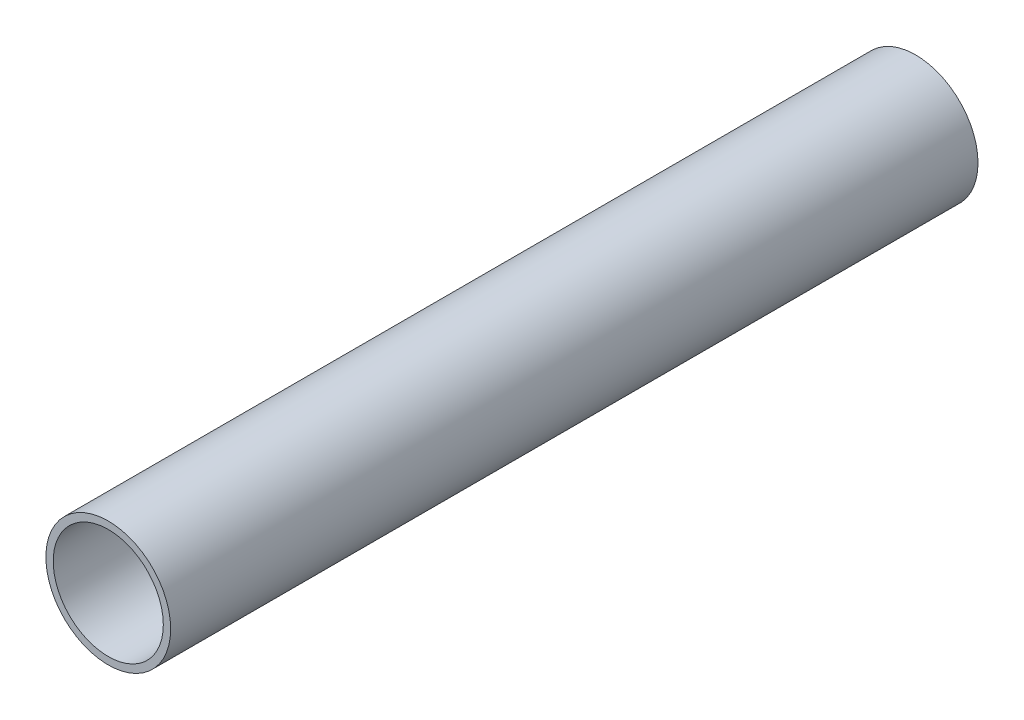
ISO-10303-21;
HEADER;
FILE_DESCRIPTION(('STEP AP214'),'2;1');
FILE_NAME('part.step','',(''),(''),'','','');
FILE_SCHEMA(('AUTOMOTIVE_DESIGN { 1 0 10303 214 1 1 1 1 }'));
ENDSEC;
DATA;
#1=APPLICATION_CONTEXT('core data for automotive mechanical design processes');
#2=APPLICATION_PROTOCOL_DEFINITION('international standard','automotive_design',2000,#1);
#3=PRODUCT_CONTEXT('',#1,'mechanical');
#4=PRODUCT('Part','Part','',(#3));
#5=PRODUCT_RELATED_PRODUCT_CATEGORY('part','',(#4));
#6=PRODUCT_DEFINITION_FORMATION('','',#4);
#7=PRODUCT_DEFINITION_CONTEXT('part definition',#1,'design');
#8=PRODUCT_DEFINITION('design','',#6,#7);
#9=PRODUCT_DEFINITION_SHAPE('','',#8);
#10=(LENGTH_UNIT() NAMED_UNIT(*) SI_UNIT(.MILLI.,.METRE.));
#11=(NAMED_UNIT(*) PLANE_ANGLE_UNIT() SI_UNIT($,.RADIAN.));
#12=(NAMED_UNIT(*) SI_UNIT($,.STERADIAN.) SOLID_ANGLE_UNIT());
#13=UNCERTAINTY_MEASURE_WITH_UNIT(LENGTH_MEASURE(1.E-05),#10,'distance_accuracy_value','');
#14=(GEOMETRIC_REPRESENTATION_CONTEXT(3) GLOBAL_UNCERTAINTY_ASSIGNED_CONTEXT((#13)) GLOBAL_UNIT_ASSIGNED_CONTEXT((#10,
#11,#12)) REPRESENTATION_CONTEXT('',''));
#15=CARTESIAN_POINT('',(0.,0.,0.));
#16=DIRECTION('',(0.,0.,1.));
#17=DIRECTION('',(1.,0.,0.));
#18=AXIS2_PLACEMENT_3D('',#15,#16,#17);
#19=CARTESIAN_POINT('',(0.,0.,110.));
#20=DIRECTION('',(0.,0.,-1.));
#21=DIRECTION('',(-1.,0.,0.));
#22=AXIS2_PLACEMENT_3D('',#19,#20,#21);
#23=CYLINDRICAL_SURFACE('',#22,15.);
#24=CARTESIAN_POINT('',(0.,0.,110.));
#25=DIRECTION('',(0.,0.,1.));
#26=DIRECTION('',(1.,0.,0.));
#27=AXIS2_PLACEMENT_3D('',#24,#25,#26);
#28=CIRCLE('',#27,15.);
#29=CARTESIAN_POINT('',(15.,0.,110.));
#30=VERTEX_POINT('',#29);
#31=EDGE_CURVE('E40',#30,#30,#28,.T.);
#32=ORIENTED_EDGE('',*,*,#31,.T.);
#33=EDGE_LOOP('',(#32));
#34=FACE_BOUND('',#33,.T.);
#35=CARTESIAN_POINT('',(0.,0.,-110.));
#36=DIRECTION('',(0.,0.,1.));
#37=DIRECTION('',(1.,0.,0.));
#38=AXIS2_PLACEMENT_3D('',#35,#36,#37);
#39=CIRCLE('',#38,15.);
#40=CARTESIAN_POINT('',(15.,0.,-110.));
#41=VERTEX_POINT('',#40);
#42=EDGE_CURVE('E46',#41,#41,#39,.T.);
#43=ORIENTED_EDGE('',*,*,#42,.F.);
#44=EDGE_LOOP('',(#43));
#45=FACE_BOUND('',#44,.T.);
#46=ADVANCED_FACE('F33',(#34,#45),#23,.F.);
#47=CARTESIAN_POINT('',(0.,0.,110.));
#48=DIRECTION('',(0.,0.,-1.));
#49=DIRECTION('',(-1.,0.,0.));
#50=AXIS2_PLACEMENT_3D('',#47,#48,#49);
#51=CYLINDRICAL_SURFACE('',#50,17.);
#52=CARTESIAN_POINT('',(0.,0.,110.));
#53=DIRECTION('',(0.,0.,1.));
#54=DIRECTION('',(1.,0.,0.));
#55=AXIS2_PLACEMENT_3D('',#52,#53,#54);
#56=CIRCLE('',#55,17.);
#57=CARTESIAN_POINT('',(17.,0.,110.));
#58=VERTEX_POINT('',#57);
#59=EDGE_CURVE('E10',#58,#58,#56,.T.);
#60=ORIENTED_EDGE('',*,*,#59,.F.);
#61=EDGE_LOOP('',(#60));
#62=FACE_BOUND('',#61,.T.);
#63=CARTESIAN_POINT('',(0.,0.,-110.));
#64=DIRECTION('',(0.,0.,1.));
#65=DIRECTION('',(1.,0.,0.));
#66=AXIS2_PLACEMENT_3D('',#63,#64,#65);
#67=CIRCLE('',#66,17.);
#68=CARTESIAN_POINT('',(17.,0.,-110.));
#69=VERTEX_POINT('',#68);
#70=EDGE_CURVE('E36',#69,#69,#67,.T.);
#71=ORIENTED_EDGE('',*,*,#70,.T.);
#72=EDGE_LOOP('',(#71));
#73=FACE_BOUND('',#72,.T.);
#74=ADVANCED_FACE('F53',(#62,#73),#51,.T.);
#75=CARTESIAN_POINT('',(0.,0.,110.));
#76=DIRECTION('',(0.,0.,1.));
#77=DIRECTION('',(1.,0.,0.));
#78=AXIS2_PLACEMENT_3D('',#75,#76,#77);
#79=PLANE('',#78);
#80=ORIENTED_EDGE('',*,*,#31,.F.);
#81=EDGE_LOOP('',(#80));
#82=FACE_BOUND('',#81,.T.);
#83=ORIENTED_EDGE('',*,*,#59,.T.);
#84=EDGE_LOOP('',(#83));
#85=FACE_BOUND('',#84,.T.);
#86=ADVANCED_FACE('F57',(#82,#85),#79,.T.);
#87=CARTESIAN_POINT('',(0.,0.,-110.));
#88=DIRECTION('',(0.,0.,1.));
#89=DIRECTION('',(1.,0.,0.));
#90=AXIS2_PLACEMENT_3D('',#87,#88,#89);
#91=PLANE('',#90);
#92=ORIENTED_EDGE('',*,*,#42,.T.);
#93=EDGE_LOOP('',(#92));
#94=FACE_BOUND('',#93,.T.);
#95=ORIENTED_EDGE('',*,*,#70,.F.);
#96=EDGE_LOOP('',(#95));
#97=FACE_BOUND('',#96,.T.);
#98=ADVANCED_FACE('F55',(#94,#97),#91,.F.);
#99=CLOSED_SHELL('',(#46,#74,#86,#98));
#100=MANIFOLD_SOLID_BREP('B2',#99);
#101=ADVANCED_BREP_SHAPE_REPRESENTATION('',(#18,#100),#14);
#102=SHAPE_DEFINITION_REPRESENTATION(#9,#101);
ENDSEC;
END-ISO-10303-21;
